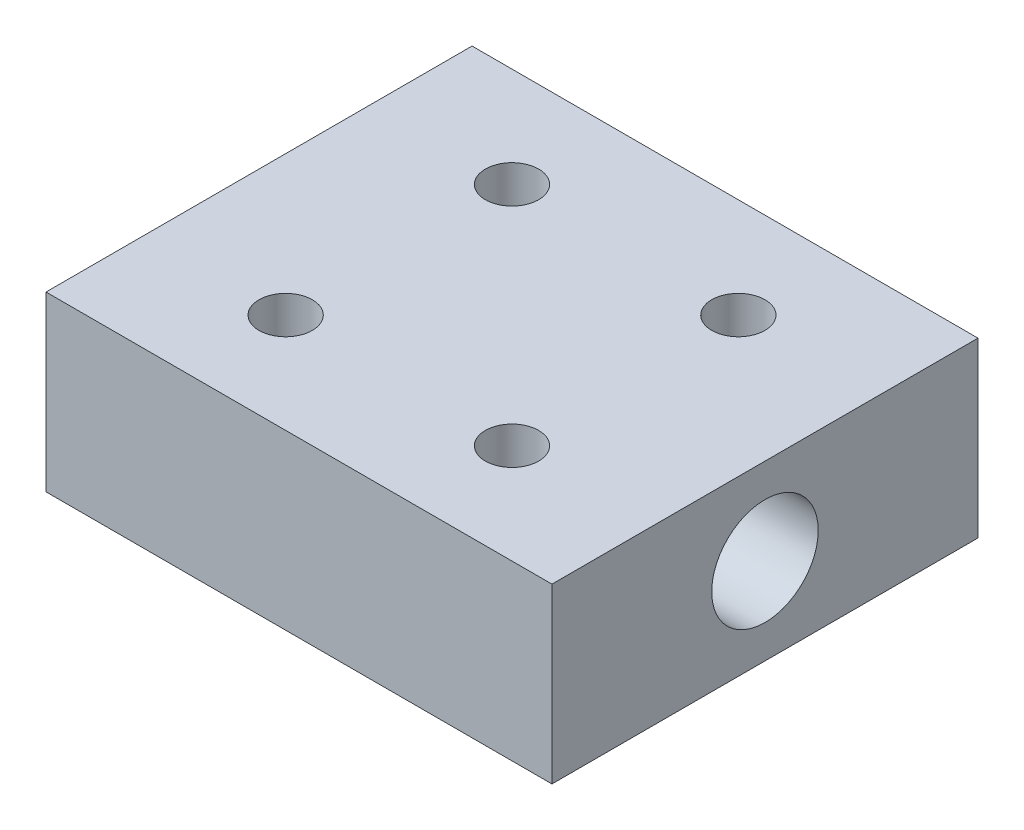
ISO-10303-21;
HEADER;
FILE_DESCRIPTION(('STEP AP214'),'2;1');
FILE_NAME('part.step','',(''),(''),'','','');
FILE_SCHEMA(('AUTOMOTIVE_DESIGN { 1 0 10303 214 1 1 1 1 }'));
ENDSEC;
DATA;
#1=APPLICATION_CONTEXT('core data for automotive mechanical design processes');
#2=APPLICATION_PROTOCOL_DEFINITION('international standard','automotive_design',2000,#1);
#3=PRODUCT_CONTEXT('',#1,'mechanical');
#4=PRODUCT('Part','Part','',(#3));
#5=PRODUCT_RELATED_PRODUCT_CATEGORY('part','',(#4));
#6=PRODUCT_DEFINITION_FORMATION('','',#4);
#7=PRODUCT_DEFINITION_CONTEXT('part definition',#1,'design');
#8=PRODUCT_DEFINITION('design','',#6,#7);
#9=PRODUCT_DEFINITION_SHAPE('','',#8);
#10=(LENGTH_UNIT() NAMED_UNIT(*) SI_UNIT(.MILLI.,.METRE.));
#11=(NAMED_UNIT(*) PLANE_ANGLE_UNIT() SI_UNIT($,.RADIAN.));
#12=(NAMED_UNIT(*) SI_UNIT($,.STERADIAN.) SOLID_ANGLE_UNIT());
#13=UNCERTAINTY_MEASURE_WITH_UNIT(LENGTH_MEASURE(1.E-05),#10,'distance_accuracy_value','');
#14=(GEOMETRIC_REPRESENTATION_CONTEXT(3) GLOBAL_UNCERTAINTY_ASSIGNED_CONTEXT((#13)) GLOBAL_UNIT_ASSIGNED_CONTEXT((#10,
#11,#12)) REPRESENTATION_CONTEXT('',''));
#15=CARTESIAN_POINT('',(0.,0.,0.));
#16=DIRECTION('',(0.,0.,1.));
#17=DIRECTION('',(1.,0.,0.));
#18=AXIS2_PLACEMENT_3D('',#15,#16,#17);
#19=CARTESIAN_POINT('',(19.,13.,16.));
#20=DIRECTION('',(-1.,0.,0.));
#21=DIRECTION('',(0.,0.,1.));
#22=AXIS2_PLACEMENT_3D('',#19,#20,#21);
#23=PLANE('',#22);
#24=CARTESIAN_POINT('',(19.,6.5,0.));
#25=DIRECTION('',(1.,0.,0.));
#26=DIRECTION('',(0.,0.,-1.));
#27=AXIS2_PLACEMENT_3D('',#24,#25,#26);
#28=CIRCLE('',#27,4.);
#29=CARTESIAN_POINT('',(19.,6.5,-4.));
#30=VERTEX_POINT('',#29);
#31=EDGE_CURVE('E142',#30,#30,#28,.T.);
#32=ORIENTED_EDGE('',*,*,#31,.F.);
#33=EDGE_LOOP('',(#32));
#34=FACE_BOUND('',#33,.T.);
#35=DIRECTION('',(0.,0.,-1.));
#36=VECTOR('',#35,1.);
#37=CARTESIAN_POINT('',(19.,0.,16.));
#38=LINE('',#37,#36);
#39=CARTESIAN_POINT('',(19.,0.,16.));
#40=VERTEX_POINT('',#39);
#41=CARTESIAN_POINT('',(19.,0.,-16.));
#42=VERTEX_POINT('',#41);
#43=EDGE_CURVE('E104',#40,#42,#38,.T.);
#44=ORIENTED_EDGE('',*,*,#43,.T.);
#45=DIRECTION('',(0.,-1.,0.));
#46=VECTOR('',#45,1.);
#47=CARTESIAN_POINT('',(19.,13.,-16.));
#48=LINE('',#47,#46);
#49=CARTESIAN_POINT('',(19.,13.,-16.));
#50=VERTEX_POINT('',#49);
#51=EDGE_CURVE('E11',#50,#42,#48,.T.);
#52=ORIENTED_EDGE('',*,*,#51,.F.);
#53=DIRECTION('',(0.,0.,-1.));
#54=VECTOR('',#53,1.);
#55=CARTESIAN_POINT('',(19.,13.,16.));
#56=LINE('',#55,#54);
#57=CARTESIAN_POINT('',(19.,13.,16.));
#58=VERTEX_POINT('',#57);
#59=EDGE_CURVE('E92',#58,#50,#56,.T.);
#60=ORIENTED_EDGE('',*,*,#59,.F.);
#61=DIRECTION('',(0.,-1.,0.));
#62=VECTOR('',#61,1.);
#63=CARTESIAN_POINT('',(19.,13.,16.));
#64=LINE('',#63,#62);
#65=EDGE_CURVE('E100',#58,#40,#64,.T.);
#66=ORIENTED_EDGE('',*,*,#65,.T.);
#67=EDGE_LOOP('',(#44,#52,#60,#66));
#68=FACE_BOUND('',#67,.T.);
#69=ADVANCED_FACE('F41',(#34,#68),#23,.F.);
#70=CARTESIAN_POINT('',(-19.,13.,-16.));
#71=DIRECTION('',(0.,0.,1.));
#72=DIRECTION('',(1.,0.,0.));
#73=AXIS2_PLACEMENT_3D('',#70,#71,#72);
#74=PLANE('',#73);
#75=DIRECTION('',(-1.,0.,0.));
#76=VECTOR('',#75,1.);
#77=CARTESIAN_POINT('',(-19.,0.,-16.));
#78=LINE('',#77,#76);
#79=CARTESIAN_POINT('',(-19.,0.,-16.));
#80=VERTEX_POINT('',#79);
#81=EDGE_CURVE('E96',#42,#80,#78,.T.);
#82=ORIENTED_EDGE('',*,*,#81,.T.);
#83=DIRECTION('',(0.,-1.,0.));
#84=VECTOR('',#83,1.);
#85=CARTESIAN_POINT('',(-19.,13.,-16.));
#86=LINE('',#85,#84);
#87=CARTESIAN_POINT('',(-19.,13.,-16.));
#88=VERTEX_POINT('',#87);
#89=EDGE_CURVE('E49',#88,#80,#86,.T.);
#90=ORIENTED_EDGE('',*,*,#89,.F.);
#91=DIRECTION('',(-1.,0.,0.));
#92=VECTOR('',#91,1.);
#93=CARTESIAN_POINT('',(-19.,13.,-16.));
#94=LINE('',#93,#92);
#95=EDGE_CURVE('E87',#50,#88,#94,.T.);
#96=ORIENTED_EDGE('',*,*,#95,.F.);
#97=ORIENTED_EDGE('',*,*,#51,.T.);
#98=EDGE_LOOP('',(#82,#90,#96,#97));
#99=FACE_BOUND('',#98,.T.);
#100=ADVANCED_FACE('F95',(#99),#74,.F.);
#101=CARTESIAN_POINT('',(-19.,13.,16.));
#102=DIRECTION('',(1.,0.,0.));
#103=DIRECTION('',(0.,0.,-1.));
#104=AXIS2_PLACEMENT_3D('',#101,#102,#103);
#105=PLANE('',#104);
#106=CARTESIAN_POINT('',(-19.,6.5,0.));
#107=DIRECTION('',(1.,0.,0.));
#108=DIRECTION('',(0.,0.,-1.));
#109=AXIS2_PLACEMENT_3D('',#106,#107,#108);
#110=CIRCLE('',#109,4.);
#111=CARTESIAN_POINT('',(-19.,6.5,-4.));
#112=VERTEX_POINT('',#111);
#113=EDGE_CURVE('E128',#112,#112,#110,.T.);
#114=ORIENTED_EDGE('',*,*,#113,.T.);
#115=EDGE_LOOP('',(#114));
#116=FACE_BOUND('',#115,.T.);
#117=DIRECTION('',(0.,0.,1.));
#118=VECTOR('',#117,1.);
#119=CARTESIAN_POINT('',(-19.,0.,16.));
#120=LINE('',#119,#118);
#121=CARTESIAN_POINT('',(-19.,0.,16.));
#122=VERTEX_POINT('',#121);
#123=EDGE_CURVE('E74',#80,#122,#120,.T.);
#124=ORIENTED_EDGE('',*,*,#123,.T.);
#125=DIRECTION('',(0.,-1.,0.));
#126=VECTOR('',#125,1.);
#127=CARTESIAN_POINT('',(-19.,13.,16.));
#128=LINE('',#127,#126);
#129=CARTESIAN_POINT('',(-19.,13.,16.));
#130=VERTEX_POINT('',#129);
#131=EDGE_CURVE('E97',#130,#122,#128,.T.);
#132=ORIENTED_EDGE('',*,*,#131,.F.);
#133=DIRECTION('',(0.,0.,1.));
#134=VECTOR('',#133,1.);
#135=CARTESIAN_POINT('',(-19.,13.,16.));
#136=LINE('',#135,#134);
#137=EDGE_CURVE('E90',#88,#130,#136,.T.);
#138=ORIENTED_EDGE('',*,*,#137,.F.);
#139=ORIENTED_EDGE('',*,*,#89,.T.);
#140=EDGE_LOOP('',(#124,#132,#138,#139));
#141=FACE_BOUND('',#140,.T.);
#142=ADVANCED_FACE('F98',(#116,#141),#105,.F.);
#143=CARTESIAN_POINT('',(-19.,13.,16.));
#144=DIRECTION('',(0.,0.,-1.));
#145=DIRECTION('',(-1.,0.,0.));
#146=AXIS2_PLACEMENT_3D('',#143,#144,#145);
#147=PLANE('',#146);
#148=DIRECTION('',(1.,0.,0.));
#149=VECTOR('',#148,1.);
#150=CARTESIAN_POINT('',(-19.,0.,16.));
#151=LINE('',#150,#149);
#152=EDGE_CURVE('E80',#122,#40,#151,.T.);
#153=ORIENTED_EDGE('',*,*,#152,.T.);
#154=ORIENTED_EDGE('',*,*,#65,.F.);
#155=DIRECTION('',(1.,0.,0.));
#156=VECTOR('',#155,1.);
#157=CARTESIAN_POINT('',(-19.,13.,16.));
#158=LINE('',#157,#156);
#159=EDGE_CURVE('E57',#130,#58,#158,.T.);
#160=ORIENTED_EDGE('',*,*,#159,.F.);
#161=ORIENTED_EDGE('',*,*,#131,.T.);
#162=EDGE_LOOP('',(#153,#154,#160,#161));
#163=FACE_BOUND('',#162,.T.);
#164=ADVANCED_FACE('F112',(#163),#147,.F.);
#165=CARTESIAN_POINT('',(0.,13.,0.));
#166=DIRECTION('',(0.,-1.,0.));
#167=DIRECTION('',(0.,0.,-1.));
#168=AXIS2_PLACEMENT_3D('',#165,#166,#167);
#169=PLANE('',#168);
#170=CARTESIAN_POINT('',(8.5,13.,8.5));
#171=DIRECTION('',(0.,1.,0.));
#172=DIRECTION('',(0.,0.,-1.));
#173=AXIS2_PLACEMENT_3D('',#170,#171,#172);
#174=CIRCLE('',#173,2.);
#175=CARTESIAN_POINT('',(8.5,13.,6.5));
#176=VERTEX_POINT('',#175);
#177=EDGE_CURVE('E124',#176,#176,#174,.T.);
#178=ORIENTED_EDGE('',*,*,#177,.F.);
#179=EDGE_LOOP('',(#178));
#180=FACE_BOUND('',#179,.T.);
#181=CARTESIAN_POINT('',(-8.5,13.,8.5));
#182=DIRECTION('',(0.,1.,0.));
#183=DIRECTION('',(0.,0.,1.));
#184=AXIS2_PLACEMENT_3D('',#181,#182,#183);
#185=CIRCLE('',#184,2.);
#186=CARTESIAN_POINT('',(-8.5,13.,10.5));
#187=VERTEX_POINT('',#186);
#188=EDGE_CURVE('E131',#187,#187,#185,.T.);
#189=ORIENTED_EDGE('',*,*,#188,.F.);
#190=EDGE_LOOP('',(#189));
#191=FACE_BOUND('',#190,.T.);
#192=CARTESIAN_POINT('',(-8.5,13.,-8.5));
#193=DIRECTION('',(0.,1.,0.));
#194=DIRECTION('',(0.,0.,-1.));
#195=AXIS2_PLACEMENT_3D('',#192,#193,#194);
#196=CIRCLE('',#195,2.);
#197=CARTESIAN_POINT('',(-8.5,13.,-10.5));
#198=VERTEX_POINT('',#197);
#199=EDGE_CURVE('E137',#198,#198,#196,.T.);
#200=ORIENTED_EDGE('',*,*,#199,.F.);
#201=EDGE_LOOP('',(#200));
#202=FACE_BOUND('',#201,.T.);
#203=CARTESIAN_POINT('',(8.5,13.,-8.5));
#204=DIRECTION('',(0.,1.,0.));
#205=DIRECTION('',(0.,0.,1.));
#206=AXIS2_PLACEMENT_3D('',#203,#204,#205);
#207=CIRCLE('',#206,2.);
#208=CARTESIAN_POINT('',(8.5,13.,-6.5));
#209=VERTEX_POINT('',#208);
#210=EDGE_CURVE('E118',#209,#209,#207,.T.);
#211=ORIENTED_EDGE('',*,*,#210,.F.);
#212=EDGE_LOOP('',(#211));
#213=FACE_BOUND('',#212,.T.);
#214=ORIENTED_EDGE('',*,*,#59,.T.);
#215=ORIENTED_EDGE('',*,*,#95,.T.);
#216=ORIENTED_EDGE('',*,*,#137,.T.);
#217=ORIENTED_EDGE('',*,*,#159,.T.);
#218=EDGE_LOOP('',(#214,#215,#216,#217));
#219=FACE_BOUND('',#218,.T.);
#220=ADVANCED_FACE('F88',(#180,#191,#202,#213,#219),#169,.F.);
#221=CARTESIAN_POINT('',(0.,0.,0.));
#222=DIRECTION('',(0.,-1.,0.));
#223=DIRECTION('',(0.,0.,-1.));
#224=AXIS2_PLACEMENT_3D('',#221,#222,#223);
#225=PLANE('',#224);
#226=ORIENTED_EDGE('',*,*,#43,.F.);
#227=ORIENTED_EDGE('',*,*,#152,.F.);
#228=ORIENTED_EDGE('',*,*,#123,.F.);
#229=ORIENTED_EDGE('',*,*,#81,.F.);
#230=EDGE_LOOP('',(#226,#227,#228,#229));
#231=FACE_BOUND('',#230,.T.);
#232=ADVANCED_FACE('F115',(#231),#225,.T.);
#233=CARTESIAN_POINT('',(8.5,5.,-8.5));
#234=DIRECTION('',(0.,1.,0.));
#235=DIRECTION('',(0.,0.,1.));
#236=AXIS2_PLACEMENT_3D('',#233,#234,#235);
#237=CYLINDRICAL_SURFACE('',#236,2.);
#238=CARTESIAN_POINT('',(8.5,5.,-8.5));
#239=DIRECTION('',(0.,1.,0.));
#240=DIRECTION('',(0.,0.,1.));
#241=AXIS2_PLACEMENT_3D('',#238,#239,#240);
#242=CIRCLE('',#241,2.);
#243=CARTESIAN_POINT('',(8.5,5.,-6.5));
#244=VERTEX_POINT('',#243);
#245=EDGE_CURVE('E107',#244,#244,#242,.T.);
#246=ORIENTED_EDGE('',*,*,#245,.F.);
#247=EDGE_LOOP('',(#246));
#248=FACE_BOUND('',#247,.T.);
#249=ORIENTED_EDGE('',*,*,#210,.T.);
#250=EDGE_LOOP('',(#249));
#251=FACE_BOUND('',#250,.T.);
#252=ADVANCED_FACE('F169',(#248,#251),#237,.F.);
#253=CARTESIAN_POINT('',(8.5,5.,-8.5));
#254=DIRECTION('',(0.,1.,0.));
#255=DIRECTION('',(0.,0.,1.));
#256=AXIS2_PLACEMENT_3D('',#253,#254,#255);
#257=PLANE('',#256);
#258=ORIENTED_EDGE('',*,*,#245,.T.);
#259=EDGE_LOOP('',(#258));
#260=FACE_BOUND('',#259,.T.);
#261=ADVANCED_FACE('F175',(#260),#257,.T.);
#262=CARTESIAN_POINT('',(-8.5,5.,-8.5));
#263=DIRECTION('',(0.,1.,0.));
#264=DIRECTION('',(0.,0.,1.));
#265=AXIS2_PLACEMENT_3D('',#262,#263,#264);
#266=CYLINDRICAL_SURFACE('',#265,2.);
#267=CARTESIAN_POINT('',(-8.5,5.,-8.5));
#268=DIRECTION('',(0.,1.,0.));
#269=DIRECTION('',(0.,0.,-1.));
#270=AXIS2_PLACEMENT_3D('',#267,#268,#269);
#271=CIRCLE('',#270,2.);
#272=CARTESIAN_POINT('',(-8.5,5.,-10.5));
#273=VERTEX_POINT('',#272);
#274=EDGE_CURVE('E121',#273,#273,#271,.T.);
#275=ORIENTED_EDGE('',*,*,#274,.F.);
#276=EDGE_LOOP('',(#275));
#277=FACE_BOUND('',#276,.T.);
#278=ORIENTED_EDGE('',*,*,#199,.T.);
#279=EDGE_LOOP('',(#278));
#280=FACE_BOUND('',#279,.T.);
#281=ADVANCED_FACE('F179',(#277,#280),#266,.F.);
#282=CARTESIAN_POINT('',(-8.5,5.,-8.5));
#283=DIRECTION('',(0.,-1.,0.));
#284=DIRECTION('',(0.,0.,-1.));
#285=AXIS2_PLACEMENT_3D('',#282,#283,#284);
#286=PLANE('',#285);
#287=ORIENTED_EDGE('',*,*,#274,.T.);
#288=EDGE_LOOP('',(#287));
#289=FACE_BOUND('',#288,.T.);
#290=ADVANCED_FACE('F192',(#289),#286,.F.);
#291=CARTESIAN_POINT('',(-8.5,5.,8.5));
#292=DIRECTION('',(0.,1.,0.));
#293=DIRECTION('',(0.,0.,1.));
#294=AXIS2_PLACEMENT_3D('',#291,#292,#293);
#295=CYLINDRICAL_SURFACE('',#294,2.);
#296=CARTESIAN_POINT('',(-8.5,5.,8.5));
#297=DIRECTION('',(0.,1.,0.));
#298=DIRECTION('',(0.,0.,1.));
#299=AXIS2_PLACEMENT_3D('',#296,#297,#298);
#300=CIRCLE('',#299,2.);
#301=CARTESIAN_POINT('',(-8.5,5.,10.5));
#302=VERTEX_POINT('',#301);
#303=EDGE_CURVE('E134',#302,#302,#300,.T.);
#304=ORIENTED_EDGE('',*,*,#303,.F.);
#305=EDGE_LOOP('',(#304));
#306=FACE_BOUND('',#305,.T.);
#307=ORIENTED_EDGE('',*,*,#188,.T.);
#308=EDGE_LOOP('',(#307));
#309=FACE_BOUND('',#308,.T.);
#310=ADVANCED_FACE('F189',(#306,#309),#295,.F.);
#311=CARTESIAN_POINT('',(-8.5,5.,8.5));
#312=DIRECTION('',(0.,1.,0.));
#313=DIRECTION('',(0.,0.,1.));
#314=AXIS2_PLACEMENT_3D('',#311,#312,#313);
#315=PLANE('',#314);
#316=ORIENTED_EDGE('',*,*,#303,.T.);
#317=EDGE_LOOP('',(#316));
#318=FACE_BOUND('',#317,.T.);
#319=ADVANCED_FACE('F184',(#318),#315,.T.);
#320=CARTESIAN_POINT('',(8.5,5.,8.5));
#321=DIRECTION('',(0.,1.,0.));
#322=DIRECTION('',(0.,0.,1.));
#323=AXIS2_PLACEMENT_3D('',#320,#321,#322);
#324=CYLINDRICAL_SURFACE('',#323,2.);
#325=CARTESIAN_POINT('',(8.5,5.,8.5));
#326=DIRECTION('',(0.,1.,0.));
#327=DIRECTION('',(0.,0.,-1.));
#328=AXIS2_PLACEMENT_3D('',#325,#326,#327);
#329=CIRCLE('',#328,2.);
#330=CARTESIAN_POINT('',(8.5,5.,6.5));
#331=VERTEX_POINT('',#330);
#332=EDGE_CURVE('E127',#331,#331,#329,.T.);
#333=ORIENTED_EDGE('',*,*,#332,.F.);
#334=EDGE_LOOP('',(#333));
#335=FACE_BOUND('',#334,.T.);
#336=ORIENTED_EDGE('',*,*,#177,.T.);
#337=EDGE_LOOP('',(#336));
#338=FACE_BOUND('',#337,.T.);
#339=ADVANCED_FACE('F181',(#335,#338),#324,.F.);
#340=CARTESIAN_POINT('',(8.5,5.,8.5));
#341=DIRECTION('',(0.,-1.,0.));
#342=DIRECTION('',(0.,0.,-1.));
#343=AXIS2_PLACEMENT_3D('',#340,#341,#342);
#344=PLANE('',#343);
#345=ORIENTED_EDGE('',*,*,#332,.T.);
#346=EDGE_LOOP('',(#345));
#347=FACE_BOUND('',#346,.T.);
#348=ADVANCED_FACE('F152',(#347),#344,.F.);
#349=CARTESIAN_POINT('',(-19.,6.5,0.));
#350=DIRECTION('',(1.,0.,0.));
#351=DIRECTION('',(0.,0.,-1.));
#352=AXIS2_PLACEMENT_3D('',#349,#350,#351);
#353=CYLINDRICAL_SURFACE('',#352,4.);
#354=ORIENTED_EDGE('',*,*,#113,.F.);
#355=EDGE_LOOP('',(#354));
#356=FACE_BOUND('',#355,.T.);
#357=ORIENTED_EDGE('',*,*,#31,.T.);
#358=EDGE_LOOP('',(#357));
#359=FACE_BOUND('',#358,.T.);
#360=ADVANCED_FACE('F149',(#356,#359),#353,.F.);
#361=CLOSED_SHELL('',(#69,#100,#142,#164,#220,#232,#252,#261,#281,#290,#310,#319,#339,#348,#360));
#362=MANIFOLD_SOLID_BREP('B2',#361);
#363=ADVANCED_BREP_SHAPE_REPRESENTATION('',(#18,#362),#14);
#364=SHAPE_DEFINITION_REPRESENTATION(#9,#363);
ENDSEC;
END-ISO-10303-21;
